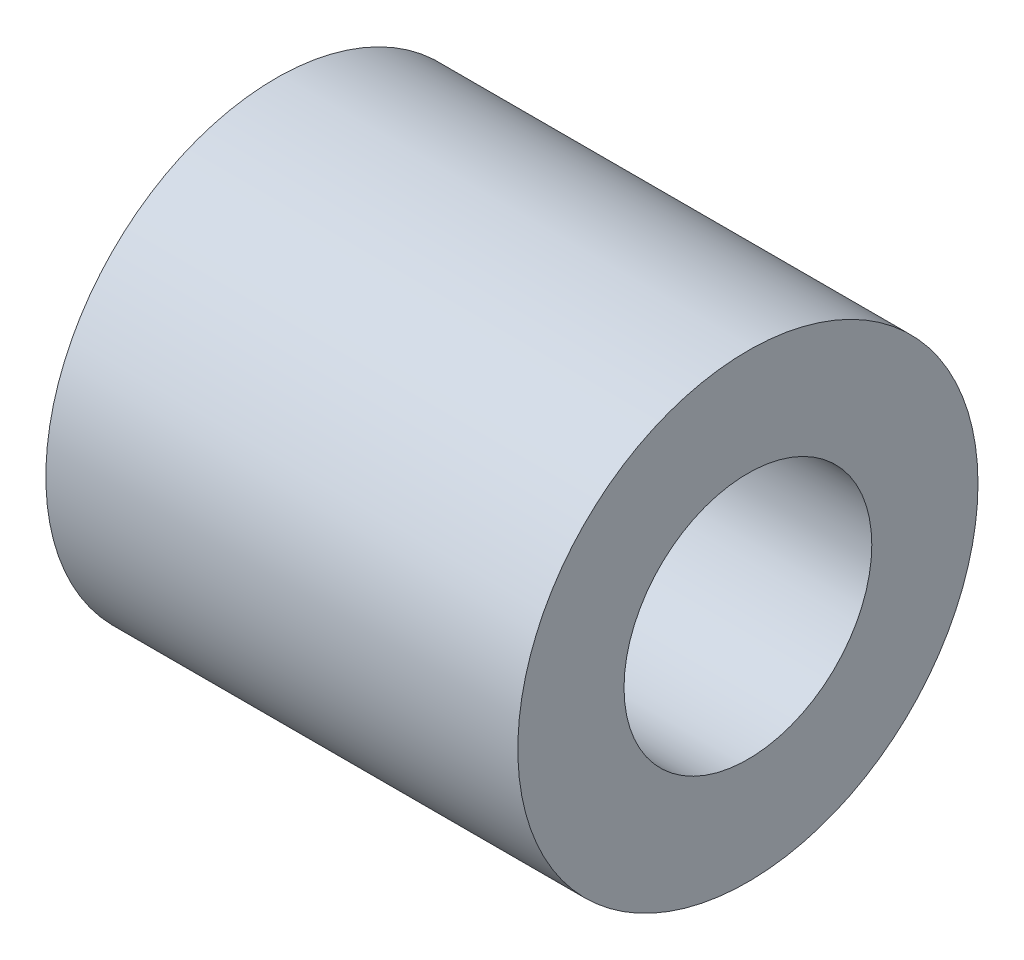
ISO-10303-21;
HEADER;
FILE_DESCRIPTION(('STEP AP214'),'2;1');
FILE_NAME('part.step','',(''),(''),'','','');
FILE_SCHEMA(('AUTOMOTIVE_DESIGN { 1 0 10303 214 1 1 1 1 }'));
ENDSEC;
DATA;
#1=APPLICATION_CONTEXT('core data for automotive mechanical design processes');
#2=APPLICATION_PROTOCOL_DEFINITION('international standard','automotive_design',2000,#1);
#3=PRODUCT_CONTEXT('',#1,'mechanical');
#4=PRODUCT('Part','Part','',(#3));
#5=PRODUCT_RELATED_PRODUCT_CATEGORY('part','',(#4));
#6=PRODUCT_DEFINITION_FORMATION('','',#4);
#7=PRODUCT_DEFINITION_CONTEXT('part definition',#1,'design');
#8=PRODUCT_DEFINITION('design','',#6,#7);
#9=PRODUCT_DEFINITION_SHAPE('','',#8);
#10=(LENGTH_UNIT() NAMED_UNIT(*) SI_UNIT(.MILLI.,.METRE.));
#11=(NAMED_UNIT(*) PLANE_ANGLE_UNIT() SI_UNIT($,.RADIAN.));
#12=(NAMED_UNIT(*) SI_UNIT($,.STERADIAN.) SOLID_ANGLE_UNIT());
#13=UNCERTAINTY_MEASURE_WITH_UNIT(LENGTH_MEASURE(1.E-05),#10,'distance_accuracy_value','');
#14=(GEOMETRIC_REPRESENTATION_CONTEXT(3) GLOBAL_UNCERTAINTY_ASSIGNED_CONTEXT((#13)) GLOBAL_UNIT_ASSIGNED_CONTEXT((#10,
#11,#12)) REPRESENTATION_CONTEXT('',''));
#15=CARTESIAN_POINT('',(0.,0.,0.));
#16=DIRECTION('',(0.,0.,1.));
#17=DIRECTION('',(1.,0.,0.));
#18=AXIS2_PLACEMENT_3D('',#15,#16,#17);
#19=CARTESIAN_POINT('',(12.,0.,0.));
#20=DIRECTION('',(1.,0.,0.));
#21=DIRECTION('',(0.,0.,-1.));
#22=AXIS2_PLACEMENT_3D('',#19,#20,#21);
#23=PLANE('',#22);
#24=CARTESIAN_POINT('',(12.,0.,0.));
#25=DIRECTION('',(1.,0.,0.));
#26=DIRECTION('',(0.,0.,-1.));
#27=AXIS2_PLACEMENT_3D('',#24,#25,#26);
#28=CIRCLE('',#27,5.85);
#29=CARTESIAN_POINT('',(12.,0.,-5.85));
#30=VERTEX_POINT('',#29);
#31=EDGE_CURVE('E10',#30,#30,#28,.T.);
#32=ORIENTED_EDGE('',*,*,#31,.T.);
#33=EDGE_LOOP('',(#32));
#34=FACE_BOUND('',#33,.T.);
#35=CARTESIAN_POINT('',(12.,0.,0.));
#36=DIRECTION('',(1.,0.,0.));
#37=DIRECTION('',(0.,0.,-1.));
#38=AXIS2_PLACEMENT_3D('',#35,#36,#37);
#39=CIRCLE('',#38,3.15);
#40=CARTESIAN_POINT('',(12.,0.,-3.15));
#41=VERTEX_POINT('',#40);
#42=EDGE_CURVE('E48',#41,#41,#39,.T.);
#43=ORIENTED_EDGE('',*,*,#42,.F.);
#44=EDGE_LOOP('',(#43));
#45=FACE_BOUND('',#44,.T.);
#46=ADVANCED_FACE('F37',(#34,#45),#23,.T.);
#47=CARTESIAN_POINT('',(0.,0.,0.));
#48=DIRECTION('',(1.,0.,0.));
#49=DIRECTION('',(0.,0.,-1.));
#50=AXIS2_PLACEMENT_3D('',#47,#48,#49);
#51=PLANE('',#50);
#52=CARTESIAN_POINT('',(0.,0.,0.));
#53=DIRECTION('',(1.,0.,0.));
#54=DIRECTION('',(0.,0.,-1.));
#55=AXIS2_PLACEMENT_3D('',#52,#53,#54);
#56=CIRCLE('',#55,5.85);
#57=CARTESIAN_POINT('',(0.,0.,-5.85));
#58=VERTEX_POINT('',#57);
#59=EDGE_CURVE('E41',#58,#58,#56,.T.);
#60=ORIENTED_EDGE('',*,*,#59,.F.);
#61=EDGE_LOOP('',(#60));
#62=FACE_BOUND('',#61,.T.);
#63=CARTESIAN_POINT('',(0.,0.,0.));
#64=DIRECTION('',(1.,0.,0.));
#65=DIRECTION('',(0.,0.,-1.));
#66=AXIS2_PLACEMENT_3D('',#63,#64,#65);
#67=CIRCLE('',#66,3.15);
#68=CARTESIAN_POINT('',(0.,0.,-3.15));
#69=VERTEX_POINT('',#68);
#70=EDGE_CURVE('E50',#69,#69,#67,.T.);
#71=ORIENTED_EDGE('',*,*,#70,.T.);
#72=EDGE_LOOP('',(#71));
#73=FACE_BOUND('',#72,.T.);
#74=ADVANCED_FACE('F60',(#62,#73),#51,.F.);
#75=CARTESIAN_POINT('',(12.,0.,0.));
#76=DIRECTION('',(-1.,0.,0.));
#77=DIRECTION('',(0.,0.,1.));
#78=AXIS2_PLACEMENT_3D('',#75,#76,#77);
#79=CYLINDRICAL_SURFACE('',#78,5.85);
#80=ORIENTED_EDGE('',*,*,#31,.F.);
#81=EDGE_LOOP('',(#80));
#82=FACE_BOUND('',#81,.T.);
#83=ORIENTED_EDGE('',*,*,#59,.T.);
#84=EDGE_LOOP('',(#83));
#85=FACE_BOUND('',#84,.T.);
#86=ADVANCED_FACE('F39',(#82,#85),#79,.T.);
#87=CARTESIAN_POINT('',(12.,0.,0.));
#88=DIRECTION('',(-1.,0.,0.));
#89=DIRECTION('',(0.,0.,1.));
#90=AXIS2_PLACEMENT_3D('',#87,#88,#89);
#91=CYLINDRICAL_SURFACE('',#90,3.15);
#92=ORIENTED_EDGE('',*,*,#42,.T.);
#93=EDGE_LOOP('',(#92));
#94=FACE_BOUND('',#93,.T.);
#95=ORIENTED_EDGE('',*,*,#70,.F.);
#96=EDGE_LOOP('',(#95));
#97=FACE_BOUND('',#96,.T.);
#98=ADVANCED_FACE('F56',(#94,#97),#91,.F.);
#99=CLOSED_SHELL('',(#46,#74,#86,#98));
#100=MANIFOLD_SOLID_BREP('B2',#99);
#101=ADVANCED_BREP_SHAPE_REPRESENTATION('',(#18,#100),#14);
#102=SHAPE_DEFINITION_REPRESENTATION(#9,#101);
ENDSEC;
END-ISO-10303-21;
